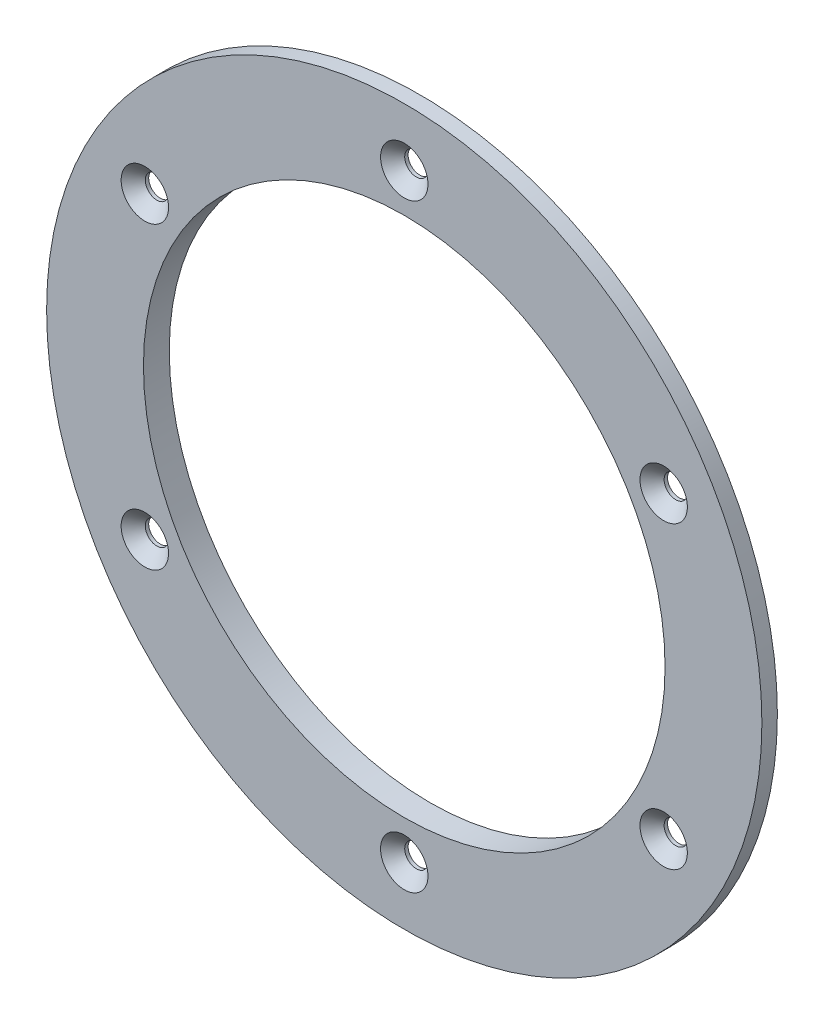
ISO-10303-21;
HEADER;
FILE_DESCRIPTION(('STEP AP214'),'2;1');
FILE_NAME('part.step','',(''),(''),'','','');
FILE_SCHEMA(('AUTOMOTIVE_DESIGN { 1 0 10303 214 1 1 1 1 }'));
ENDSEC;
DATA;
#1=APPLICATION_CONTEXT('core data for automotive mechanical design processes');
#2=APPLICATION_PROTOCOL_DEFINITION('international standard','automotive_design',2000,#1);
#3=PRODUCT_CONTEXT('',#1,'mechanical');
#4=PRODUCT('Part','Part','',(#3));
#5=PRODUCT_RELATED_PRODUCT_CATEGORY('part','',(#4));
#6=PRODUCT_DEFINITION_FORMATION('','',#4);
#7=PRODUCT_DEFINITION_CONTEXT('part definition',#1,'design');
#8=PRODUCT_DEFINITION('design','',#6,#7);
#9=PRODUCT_DEFINITION_SHAPE('','',#8);
#10=(LENGTH_UNIT() NAMED_UNIT(*) SI_UNIT(.MILLI.,.METRE.));
#11=(NAMED_UNIT(*) PLANE_ANGLE_UNIT() SI_UNIT($,.RADIAN.));
#12=(NAMED_UNIT(*) SI_UNIT($,.STERADIAN.) SOLID_ANGLE_UNIT());
#13=UNCERTAINTY_MEASURE_WITH_UNIT(LENGTH_MEASURE(1.E-05),#10,'distance_accuracy_value','');
#14=(GEOMETRIC_REPRESENTATION_CONTEXT(3) GLOBAL_UNCERTAINTY_ASSIGNED_CONTEXT((#13)) GLOBAL_UNIT_ASSIGNED_CONTEXT((#10,
#11,#12)) REPRESENTATION_CONTEXT('',''));
#15=CARTESIAN_POINT('',(0.,0.,0.));
#16=DIRECTION('',(0.,0.,1.));
#17=DIRECTION('',(1.,0.,0.));
#18=AXIS2_PLACEMENT_3D('',#15,#16,#17);
#19=CARTESIAN_POINT('',(0.,0.,0.));
#20=DIRECTION('',(0.,0.,1.));
#21=DIRECTION('',(1.,0.,0.));
#22=AXIS2_PLACEMENT_3D('',#19,#20,#21);
#23=PLANE('',#22);
#24=CARTESIAN_POINT('',(0.,0.,0.));
#25=DIRECTION('',(0.,0.,1.));
#26=DIRECTION('',(1.,0.,0.));
#27=AXIS2_PLACEMENT_3D('',#24,#25,#26);
#28=CIRCLE('',#27,69.25);
#29=CARTESIAN_POINT('',(69.25,0.,0.));
#30=VERTEX_POINT('',#29);
#31=EDGE_CURVE('E41',#30,#30,#28,.T.);
#32=ORIENTED_EDGE('',*,*,#31,.F.);
#33=EDGE_LOOP('',(#32));
#34=FACE_BOUND('',#33,.T.);
#35=CARTESIAN_POINT('',(0.,58.,0.));
#36=DIRECTION('',(0.,0.,1.));
#37=DIRECTION('',(1.,0.,0.));
#38=AXIS2_PLACEMENT_3D('',#35,#36,#37);
#39=CIRCLE('',#38,2.25);
#40=CARTESIAN_POINT('',(2.25,58.,0.));
#41=VERTEX_POINT('',#40);
#42=EDGE_CURVE('E50',#41,#41,#39,.T.);
#43=ORIENTED_EDGE('',*,*,#42,.T.);
#44=EDGE_LOOP('',(#43));
#45=FACE_BOUND('',#44,.T.);
#46=CARTESIAN_POINT('',(50.2294734194975,28.9999999999999,0.));
#47=DIRECTION('',(0.,0.,1.));
#48=DIRECTION('',(1.,0.,0.));
#49=AXIS2_PLACEMENT_3D('',#46,#47,#48);
#50=CIRCLE('',#49,2.25);
#51=CARTESIAN_POINT('',(52.4794734194975,28.9999999999999,0.));
#52=VERTEX_POINT('',#51);
#53=EDGE_CURVE('E59',#52,#52,#50,.T.);
#54=ORIENTED_EDGE('',*,*,#53,.T.);
#55=EDGE_LOOP('',(#54));
#56=FACE_BOUND('',#55,.T.);
#57=CARTESIAN_POINT('',(50.2294734194973,-29.0000000000002,0.));
#58=DIRECTION('',(0.,0.,1.));
#59=DIRECTION('',(1.,0.,0.));
#60=AXIS2_PLACEMENT_3D('',#57,#58,#59);
#61=CIRCLE('',#60,2.25);
#62=CARTESIAN_POINT('',(52.4794734194973,-29.0000000000002,0.));
#63=VERTEX_POINT('',#62);
#64=EDGE_CURVE('E68',#63,#63,#61,.T.);
#65=ORIENTED_EDGE('',*,*,#64,.T.);
#66=EDGE_LOOP('',(#65));
#67=FACE_BOUND('',#66,.T.);
#68=CARTESIAN_POINT('',(-4.05011835305803E-13,-58.,0.));
#69=DIRECTION('',(0.,0.,1.));
#70=DIRECTION('',(1.,0.,0.));
#71=AXIS2_PLACEMENT_3D('',#68,#69,#70);
#72=CIRCLE('',#71,2.25);
#73=CARTESIAN_POINT('',(2.24999999999959,-58.,0.));
#74=VERTEX_POINT('',#73);
#75=EDGE_CURVE('E77',#74,#74,#72,.T.);
#76=ORIENTED_EDGE('',*,*,#75,.T.);
#77=EDGE_LOOP('',(#76));
#78=FACE_BOUND('',#77,.T.);
#79=CARTESIAN_POINT('',(-50.2294734194977,-28.9999999999995,0.));
#80=DIRECTION('',(0.,0.,1.));
#81=DIRECTION('',(1.,0.,0.));
#82=AXIS2_PLACEMENT_3D('',#79,#80,#81);
#83=CIRCLE('',#82,2.25);
#84=CARTESIAN_POINT('',(-47.9794734194977,-28.9999999999995,0.));
#85=VERTEX_POINT('',#84);
#86=EDGE_CURVE('E86',#85,#85,#83,.T.);
#87=ORIENTED_EDGE('',*,*,#86,.T.);
#88=EDGE_LOOP('',(#87));
#89=FACE_BOUND('',#88,.T.);
#90=CARTESIAN_POINT('',(-50.2294734194971,29.0000000000006,0.));
#91=DIRECTION('',(0.,0.,1.));
#92=DIRECTION('',(1.,0.,0.));
#93=AXIS2_PLACEMENT_3D('',#90,#91,#92);
#94=CIRCLE('',#93,2.25);
#95=CARTESIAN_POINT('',(-47.9794734194971,29.0000000000006,0.));
#96=VERTEX_POINT('',#95);
#97=EDGE_CURVE('E95',#96,#96,#94,.T.);
#98=ORIENTED_EDGE('',*,*,#97,.T.);
#99=EDGE_LOOP('',(#98));
#100=FACE_BOUND('',#99,.T.);
#101=CARTESIAN_POINT('',(0.,0.,0.));
#102=DIRECTION('',(0.,0.,1.));
#103=DIRECTION('',(1.,0.,0.));
#104=AXIS2_PLACEMENT_3D('',#101,#102,#103);
#105=CIRCLE('',#104,52.5);
#106=CARTESIAN_POINT('',(52.5,0.,0.));
#107=VERTEX_POINT('',#106);
#108=EDGE_CURVE('E10',#107,#107,#105,.F.);
#109=ORIENTED_EDGE('',*,*,#108,.F.);
#110=EDGE_LOOP('',(#109));
#111=FACE_BOUND('',#110,.T.);
#112=ADVANCED_FACE('F30',(#34,#45,#56,#67,#78,#89,#100,#111),#23,.F.);
#113=CARTESIAN_POINT('',(0.,0.,3.));
#114=DIRECTION('',(0.,0.,1.));
#115=DIRECTION('',(1.,0.,0.));
#116=AXIS2_PLACEMENT_3D('',#113,#114,#115);
#117=PLANE('',#116);
#118=CARTESIAN_POINT('',(-50.2294734194971,29.0000000000006,3.));
#119=DIRECTION('',(0.,0.,1.));
#120=DIRECTION('',(1.,0.,0.));
#121=AXIS2_PLACEMENT_3D('',#118,#119,#120);
#122=CIRCLE('',#121,4.59);
#123=CARTESIAN_POINT('',(-45.6394734194971,29.0000000000006,3.));
#124=VERTEX_POINT('',#123);
#125=EDGE_CURVE('E101',#124,#124,#122,.T.);
#126=ORIENTED_EDGE('',*,*,#125,.F.);
#127=EDGE_LOOP('',(#126));
#128=FACE_BOUND('',#127,.T.);
#129=CARTESIAN_POINT('',(-50.2294734194977,-28.9999999999995,3.));
#130=DIRECTION('',(0.,0.,1.));
#131=DIRECTION('',(1.,0.,0.));
#132=AXIS2_PLACEMENT_3D('',#129,#130,#131);
#133=CIRCLE('',#132,4.59);
#134=CARTESIAN_POINT('',(-45.6394734194977,-28.9999999999995,3.));
#135=VERTEX_POINT('',#134);
#136=EDGE_CURVE('E92',#135,#135,#133,.T.);
#137=ORIENTED_EDGE('',*,*,#136,.F.);
#138=EDGE_LOOP('',(#137));
#139=FACE_BOUND('',#138,.T.);
#140=CARTESIAN_POINT('',(-4.05011835305803E-13,-58.,3.));
#141=DIRECTION('',(0.,0.,1.));
#142=DIRECTION('',(1.,0.,0.));
#143=AXIS2_PLACEMENT_3D('',#140,#141,#142);
#144=CIRCLE('',#143,4.59);
#145=CARTESIAN_POINT('',(4.58999999999959,-58.,3.));
#146=VERTEX_POINT('',#145);
#147=EDGE_CURVE('E83',#146,#146,#144,.T.);
#148=ORIENTED_EDGE('',*,*,#147,.F.);
#149=EDGE_LOOP('',(#148));
#150=FACE_BOUND('',#149,.T.);
#151=CARTESIAN_POINT('',(50.2294734194973,-29.0000000000002,3.));
#152=DIRECTION('',(0.,0.,1.));
#153=DIRECTION('',(1.,0.,0.));
#154=AXIS2_PLACEMENT_3D('',#151,#152,#153);
#155=CIRCLE('',#154,4.59);
#156=CARTESIAN_POINT('',(54.8194734194973,-29.0000000000002,3.));
#157=VERTEX_POINT('',#156);
#158=EDGE_CURVE('E74',#157,#157,#155,.T.);
#159=ORIENTED_EDGE('',*,*,#158,.F.);
#160=EDGE_LOOP('',(#159));
#161=FACE_BOUND('',#160,.T.);
#162=CARTESIAN_POINT('',(50.2294734194975,28.9999999999999,3.));
#163=DIRECTION('',(0.,0.,1.));
#164=DIRECTION('',(1.,0.,0.));
#165=AXIS2_PLACEMENT_3D('',#162,#163,#164);
#166=CIRCLE('',#165,4.59);
#167=CARTESIAN_POINT('',(54.8194734194975,28.9999999999999,3.));
#168=VERTEX_POINT('',#167);
#169=EDGE_CURVE('E65',#168,#168,#166,.T.);
#170=ORIENTED_EDGE('',*,*,#169,.F.);
#171=EDGE_LOOP('',(#170));
#172=FACE_BOUND('',#171,.T.);
#173=CARTESIAN_POINT('',(0.,58.,3.));
#174=DIRECTION('',(0.,0.,1.));
#175=DIRECTION('',(1.,0.,0.));
#176=AXIS2_PLACEMENT_3D('',#173,#174,#175);
#177=CIRCLE('',#176,4.59);
#178=CARTESIAN_POINT('',(4.59,58.,3.));
#179=VERTEX_POINT('',#178);
#180=EDGE_CURVE('E56',#179,#179,#177,.T.);
#181=ORIENTED_EDGE('',*,*,#180,.F.);
#182=EDGE_LOOP('',(#181));
#183=FACE_BOUND('',#182,.T.);
#184=CARTESIAN_POINT('',(0.,0.,3.));
#185=DIRECTION('',(0.,0.,1.));
#186=DIRECTION('',(1.,0.,0.));
#187=AXIS2_PLACEMENT_3D('',#184,#185,#186);
#188=CIRCLE('',#187,69.25);
#189=CARTESIAN_POINT('',(69.25,0.,3.));
#190=VERTEX_POINT('',#189);
#191=EDGE_CURVE('E37',#190,#190,#188,.T.);
#192=ORIENTED_EDGE('',*,*,#191,.T.);
#193=EDGE_LOOP('',(#192));
#194=FACE_BOUND('',#193,.T.);
#195=CARTESIAN_POINT('',(0.,0.,3.));
#196=DIRECTION('',(0.,0.,1.));
#197=DIRECTION('',(1.,0.,0.));
#198=AXIS2_PLACEMENT_3D('',#195,#196,#197);
#199=CIRCLE('',#198,50.5);
#200=CARTESIAN_POINT('',(50.5,0.,3.));
#201=VERTEX_POINT('',#200);
#202=EDGE_CURVE('E46',#201,#201,#199,.T.);
#203=ORIENTED_EDGE('',*,*,#202,.F.);
#204=EDGE_LOOP('',(#203));
#205=FACE_BOUND('',#204,.T.);
#206=ADVANCED_FACE('F129',(#128,#139,#150,#161,#172,#183,#194,#205),#117,.T.);
#207=CARTESIAN_POINT('',(0.,0.,3.));
#208=DIRECTION('',(0.,0.,-1.));
#209=DIRECTION('',(-1.,0.,0.));
#210=AXIS2_PLACEMENT_3D('',#207,#208,#209);
#211=CYLINDRICAL_SURFACE('',#210,69.25);
#212=ORIENTED_EDGE('',*,*,#191,.F.);
#213=EDGE_LOOP('',(#212));
#214=FACE_BOUND('',#213,.T.);
#215=ORIENTED_EDGE('',*,*,#31,.T.);
#216=EDGE_LOOP('',(#215));
#217=FACE_BOUND('',#216,.T.);
#218=ADVANCED_FACE('F32',(#214,#217),#211,.T.);
#219=CARTESIAN_POINT('',(0.,0.,3.));
#220=DIRECTION('',(0.,0.,-1.));
#221=DIRECTION('',(-1.,0.,0.));
#222=AXIS2_PLACEMENT_3D('',#219,#220,#221);
#223=CYLINDRICAL_SURFACE('',#222,50.5);
#224=ORIENTED_EDGE('',*,*,#202,.T.);
#225=EDGE_LOOP('',(#224));
#226=FACE_BOUND('',#225,.T.);
#227=CARTESIAN_POINT('',(0.,0.,-2.));
#228=DIRECTION('',(0.,0.,-1.));
#229=DIRECTION('',(-1.,0.,0.));
#230=AXIS2_PLACEMENT_3D('',#227,#228,#229);
#231=CIRCLE('',#230,50.5);
#232=CARTESIAN_POINT('',(-50.5,0.,-2.));
#233=VERTEX_POINT('',#232);
#234=EDGE_CURVE('E107',#233,#233,#231,.T.);
#235=ORIENTED_EDGE('',*,*,#234,.T.);
#236=EDGE_LOOP('',(#235));
#237=FACE_BOUND('',#236,.T.);
#238=ADVANCED_FACE('F111',(#226,#237),#223,.F.);
#239=CARTESIAN_POINT('',(0.,58.,3.));
#240=DIRECTION('',(0.,0.,1.));
#241=DIRECTION('',(1.,0.,0.));
#242=AXIS2_PLACEMENT_3D('',#239,#240,#241);
#243=CYLINDRICAL_SURFACE('',#242,2.25);
#244=ORIENTED_EDGE('',*,*,#42,.F.);
#245=EDGE_LOOP('',(#244));
#246=FACE_BOUND('',#245,.T.);
#247=CARTESIAN_POINT('',(0.,58.,0.66));
#248=DIRECTION('',(0.,0.,1.));
#249=DIRECTION('',(1.,0.,0.));
#250=AXIS2_PLACEMENT_3D('',#247,#248,#249);
#251=CIRCLE('',#250,2.25);
#252=CARTESIAN_POINT('',(2.25,58.,0.66));
#253=VERTEX_POINT('',#252);
#254=EDGE_CURVE('E53',#253,#253,#251,.T.);
#255=ORIENTED_EDGE('',*,*,#254,.T.);
#256=EDGE_LOOP('',(#255));
#257=FACE_BOUND('',#256,.T.);
#258=ADVANCED_FACE('F141',(#246,#257),#243,.F.);
#259=CARTESIAN_POINT('',(0.,58.,3.));
#260=DIRECTION('',(0.,0.,1.));
#261=DIRECTION('',(1.,0.,0.));
#262=AXIS2_PLACEMENT_3D('',#259,#260,#261);
#263=CONICAL_SURFACE('',#262,4.59,0.785398163397449);
#264=ORIENTED_EDGE('',*,*,#254,.F.);
#265=EDGE_LOOP('',(#264));
#266=FACE_BOUND('',#265,.T.);
#267=ORIENTED_EDGE('',*,*,#180,.T.);
#268=EDGE_LOOP('',(#267));
#269=FACE_BOUND('',#268,.T.);
#270=ADVANCED_FACE('F145',(#266,#269),#263,.F.);
#271=CARTESIAN_POINT('',(50.2294734194975,28.9999999999999,3.));
#272=DIRECTION('',(0.,0.,1.));
#273=DIRECTION('',(1.,0.,0.));
#274=AXIS2_PLACEMENT_3D('',#271,#272,#273);
#275=CYLINDRICAL_SURFACE('',#274,2.25);
#276=ORIENTED_EDGE('',*,*,#53,.F.);
#277=EDGE_LOOP('',(#276));
#278=FACE_BOUND('',#277,.T.);
#279=CARTESIAN_POINT('',(50.2294734194975,28.9999999999999,0.66));
#280=DIRECTION('',(0.,0.,1.));
#281=DIRECTION('',(1.,0.,0.));
#282=AXIS2_PLACEMENT_3D('',#279,#280,#281);
#283=CIRCLE('',#282,2.25);
#284=CARTESIAN_POINT('',(52.4794734194975,28.9999999999999,0.66));
#285=VERTEX_POINT('',#284);
#286=EDGE_CURVE('E62',#285,#285,#283,.T.);
#287=ORIENTED_EDGE('',*,*,#286,.T.);
#288=EDGE_LOOP('',(#287));
#289=FACE_BOUND('',#288,.T.);
#290=ADVANCED_FACE('F149',(#278,#289),#275,.F.);
#291=CARTESIAN_POINT('',(50.2294734194975,28.9999999999999,3.));
#292=DIRECTION('',(0.,0.,1.));
#293=DIRECTION('',(1.,0.,0.));
#294=AXIS2_PLACEMENT_3D('',#291,#292,#293);
#295=CONICAL_SURFACE('',#294,4.59,0.785398163397449);
#296=ORIENTED_EDGE('',*,*,#286,.F.);
#297=EDGE_LOOP('',(#296));
#298=FACE_BOUND('',#297,.T.);
#299=ORIENTED_EDGE('',*,*,#169,.T.);
#300=EDGE_LOOP('',(#299));
#301=FACE_BOUND('',#300,.T.);
#302=ADVANCED_FACE('F153',(#298,#301),#295,.F.);
#303=CARTESIAN_POINT('',(50.2294734194973,-29.0000000000002,3.));
#304=DIRECTION('',(0.,0.,1.));
#305=DIRECTION('',(1.,0.,0.));
#306=AXIS2_PLACEMENT_3D('',#303,#304,#305);
#307=CYLINDRICAL_SURFACE('',#306,2.25);
#308=ORIENTED_EDGE('',*,*,#64,.F.);
#309=EDGE_LOOP('',(#308));
#310=FACE_BOUND('',#309,.T.);
#311=CARTESIAN_POINT('',(50.2294734194973,-29.0000000000002,0.66));
#312=DIRECTION('',(0.,0.,1.));
#313=DIRECTION('',(1.,0.,0.));
#314=AXIS2_PLACEMENT_3D('',#311,#312,#313);
#315=CIRCLE('',#314,2.25);
#316=CARTESIAN_POINT('',(52.4794734194973,-29.0000000000002,0.66));
#317=VERTEX_POINT('',#316);
#318=EDGE_CURVE('E71',#317,#317,#315,.T.);
#319=ORIENTED_EDGE('',*,*,#318,.T.);
#320=EDGE_LOOP('',(#319));
#321=FACE_BOUND('',#320,.T.);
#322=ADVANCED_FACE('F157',(#310,#321),#307,.F.);
#323=CARTESIAN_POINT('',(50.2294734194973,-29.0000000000002,3.));
#324=DIRECTION('',(0.,0.,1.));
#325=DIRECTION('',(1.,0.,0.));
#326=AXIS2_PLACEMENT_3D('',#323,#324,#325);
#327=CONICAL_SURFACE('',#326,4.59,0.785398163397449);
#328=ORIENTED_EDGE('',*,*,#318,.F.);
#329=EDGE_LOOP('',(#328));
#330=FACE_BOUND('',#329,.T.);
#331=ORIENTED_EDGE('',*,*,#158,.T.);
#332=EDGE_LOOP('',(#331));
#333=FACE_BOUND('',#332,.T.);
#334=ADVANCED_FACE('F161',(#330,#333),#327,.F.);
#335=CARTESIAN_POINT('',(-4.05011835305803E-13,-58.,3.));
#336=DIRECTION('',(0.,0.,1.));
#337=DIRECTION('',(1.,0.,0.));
#338=AXIS2_PLACEMENT_3D('',#335,#336,#337);
#339=CYLINDRICAL_SURFACE('',#338,2.25);
#340=ORIENTED_EDGE('',*,*,#75,.F.);
#341=EDGE_LOOP('',(#340));
#342=FACE_BOUND('',#341,.T.);
#343=CARTESIAN_POINT('',(-4.05011835305803E-13,-58.,0.66));
#344=DIRECTION('',(0.,0.,1.));
#345=DIRECTION('',(1.,0.,0.));
#346=AXIS2_PLACEMENT_3D('',#343,#344,#345);
#347=CIRCLE('',#346,2.25);
#348=CARTESIAN_POINT('',(2.24999999999959,-58.,0.66));
#349=VERTEX_POINT('',#348);
#350=EDGE_CURVE('E80',#349,#349,#347,.T.);
#351=ORIENTED_EDGE('',*,*,#350,.T.);
#352=EDGE_LOOP('',(#351));
#353=FACE_BOUND('',#352,.T.);
#354=ADVANCED_FACE('F165',(#342,#353),#339,.F.);
#355=CARTESIAN_POINT('',(-4.05011835305803E-13,-58.,3.));
#356=DIRECTION('',(0.,0.,1.));
#357=DIRECTION('',(1.,0.,0.));
#358=AXIS2_PLACEMENT_3D('',#355,#356,#357);
#359=CONICAL_SURFACE('',#358,4.59,0.785398163397449);
#360=ORIENTED_EDGE('',*,*,#350,.F.);
#361=EDGE_LOOP('',(#360));
#362=FACE_BOUND('',#361,.T.);
#363=ORIENTED_EDGE('',*,*,#147,.T.);
#364=EDGE_LOOP('',(#363));
#365=FACE_BOUND('',#364,.T.);
#366=ADVANCED_FACE('F169',(#362,#365),#359,.F.);
#367=CARTESIAN_POINT('',(-50.2294734194977,-28.9999999999995,3.));
#368=DIRECTION('',(0.,0.,1.));
#369=DIRECTION('',(1.,0.,0.));
#370=AXIS2_PLACEMENT_3D('',#367,#368,#369);
#371=CYLINDRICAL_SURFACE('',#370,2.25);
#372=ORIENTED_EDGE('',*,*,#86,.F.);
#373=EDGE_LOOP('',(#372));
#374=FACE_BOUND('',#373,.T.);
#375=CARTESIAN_POINT('',(-50.2294734194977,-28.9999999999995,0.66));
#376=DIRECTION('',(0.,0.,1.));
#377=DIRECTION('',(1.,0.,0.));
#378=AXIS2_PLACEMENT_3D('',#375,#376,#377);
#379=CIRCLE('',#378,2.25);
#380=CARTESIAN_POINT('',(-47.9794734194977,-28.9999999999995,0.66));
#381=VERTEX_POINT('',#380);
#382=EDGE_CURVE('E89',#381,#381,#379,.T.);
#383=ORIENTED_EDGE('',*,*,#382,.T.);
#384=EDGE_LOOP('',(#383));
#385=FACE_BOUND('',#384,.T.);
#386=ADVANCED_FACE('F173',(#374,#385),#371,.F.);
#387=CARTESIAN_POINT('',(-50.2294734194977,-28.9999999999995,3.));
#388=DIRECTION('',(0.,0.,1.));
#389=DIRECTION('',(1.,0.,0.));
#390=AXIS2_PLACEMENT_3D('',#387,#388,#389);
#391=CONICAL_SURFACE('',#390,4.59,0.785398163397447);
#392=ORIENTED_EDGE('',*,*,#382,.F.);
#393=EDGE_LOOP('',(#392));
#394=FACE_BOUND('',#393,.T.);
#395=ORIENTED_EDGE('',*,*,#136,.T.);
#396=EDGE_LOOP('',(#395));
#397=FACE_BOUND('',#396,.T.);
#398=ADVANCED_FACE('F177',(#394,#397),#391,.F.);
#399=CARTESIAN_POINT('',(-50.2294734194971,29.0000000000006,3.));
#400=DIRECTION('',(0.,0.,1.));
#401=DIRECTION('',(1.,0.,0.));
#402=AXIS2_PLACEMENT_3D('',#399,#400,#401);
#403=CYLINDRICAL_SURFACE('',#402,2.25);
#404=ORIENTED_EDGE('',*,*,#97,.F.);
#405=EDGE_LOOP('',(#404));
#406=FACE_BOUND('',#405,.T.);
#407=CARTESIAN_POINT('',(-50.2294734194971,29.0000000000006,0.66));
#408=DIRECTION('',(0.,0.,1.));
#409=DIRECTION('',(1.,0.,0.));
#410=AXIS2_PLACEMENT_3D('',#407,#408,#409);
#411=CIRCLE('',#410,2.25);
#412=CARTESIAN_POINT('',(-47.9794734194971,29.0000000000006,0.66));
#413=VERTEX_POINT('',#412);
#414=EDGE_CURVE('E98',#413,#413,#411,.T.);
#415=ORIENTED_EDGE('',*,*,#414,.T.);
#416=EDGE_LOOP('',(#415));
#417=FACE_BOUND('',#416,.T.);
#418=ADVANCED_FACE('F125',(#406,#417),#403,.F.);
#419=CARTESIAN_POINT('',(-50.2294734194971,29.0000000000006,3.));
#420=DIRECTION('',(0.,0.,1.));
#421=DIRECTION('',(1.,0.,0.));
#422=AXIS2_PLACEMENT_3D('',#419,#420,#421);
#423=CONICAL_SURFACE('',#422,4.59,0.785398163397449);
#424=ORIENTED_EDGE('',*,*,#414,.F.);
#425=EDGE_LOOP('',(#424));
#426=FACE_BOUND('',#425,.T.);
#427=ORIENTED_EDGE('',*,*,#125,.T.);
#428=EDGE_LOOP('',(#427));
#429=FACE_BOUND('',#428,.T.);
#430=ADVANCED_FACE('F116',(#426,#429),#423,.F.);
#431=CARTESIAN_POINT('',(0.,0.,-2.));
#432=DIRECTION('',(0.,0.,-1.));
#433=DIRECTION('',(-1.,0.,0.));
#434=AXIS2_PLACEMENT_3D('',#431,#432,#433);
#435=PLANE('',#434);
#436=CARTESIAN_POINT('',(0.,0.,-2.));
#437=DIRECTION('',(0.,0.,-1.));
#438=DIRECTION('',(-1.,0.,0.));
#439=AXIS2_PLACEMENT_3D('',#436,#437,#438);
#440=CIRCLE('',#439,52.5);
#441=CARTESIAN_POINT('',(-52.5,0.,-2.));
#442=VERTEX_POINT('',#441);
#443=EDGE_CURVE('E104',#442,#442,#440,.T.);
#444=ORIENTED_EDGE('',*,*,#443,.T.);
#445=EDGE_LOOP('',(#444));
#446=FACE_BOUND('',#445,.T.);
#447=ORIENTED_EDGE('',*,*,#234,.F.);
#448=EDGE_LOOP('',(#447));
#449=FACE_BOUND('',#448,.T.);
#450=ADVANCED_FACE('F113',(#446,#449),#435,.T.);
#451=CARTESIAN_POINT('',(0.,0.,-2.));
#452=DIRECTION('',(0.,0.,1.));
#453=DIRECTION('',(1.,0.,0.));
#454=AXIS2_PLACEMENT_3D('',#451,#452,#453);
#455=CYLINDRICAL_SURFACE('',#454,52.5);
#456=ORIENTED_EDGE('',*,*,#443,.F.);
#457=EDGE_LOOP('',(#456));
#458=FACE_BOUND('',#457,.T.);
#459=ORIENTED_EDGE('',*,*,#108,.T.);
#460=EDGE_LOOP('',(#459));
#461=FACE_BOUND('',#460,.T.);
#462=ADVANCED_FACE('F115',(#458,#461),#455,.T.);
#463=CLOSED_SHELL('',(#112,#206,#218,#238,#258,#270,#290,#302,#322,#334,#354,#366,#386,#398,
#418,#430,#450,#462));
#464=MANIFOLD_SOLID_BREP('B2',#463);
#465=ADVANCED_BREP_SHAPE_REPRESENTATION('',(#18,#464),#14);
#466=SHAPE_DEFINITION_REPRESENTATION(#9,#465);
ENDSEC;
END-ISO-10303-21;
